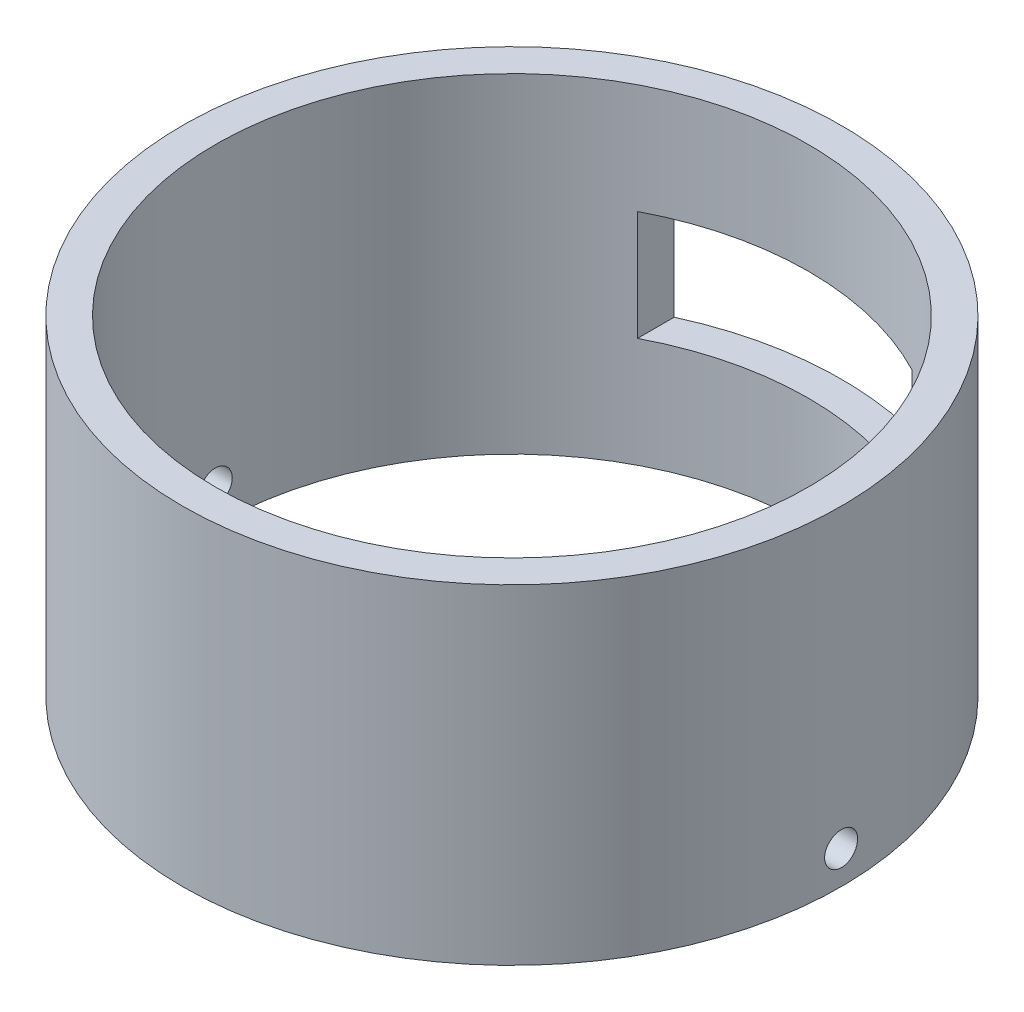
ISO-10303-21;
HEADER;
FILE_DESCRIPTION(('STEP AP214'),'2;1');
FILE_NAME('part.step','',(''),(''),'','','');
FILE_SCHEMA(('AUTOMOTIVE_DESIGN { 1 0 10303 214 1 1 1 1 }'));
ENDSEC;
DATA;
#1=APPLICATION_CONTEXT('core data for automotive mechanical design processes');
#2=APPLICATION_PROTOCOL_DEFINITION('international standard','automotive_design',2000,#1);
#3=PRODUCT_CONTEXT('',#1,'mechanical');
#4=PRODUCT('Part','Part','',(#3));
#5=PRODUCT_RELATED_PRODUCT_CATEGORY('part','',(#4));
#6=PRODUCT_DEFINITION_FORMATION('','',#4);
#7=PRODUCT_DEFINITION_CONTEXT('part definition',#1,'design');
#8=PRODUCT_DEFINITION('design','',#6,#7);
#9=PRODUCT_DEFINITION_SHAPE('','',#8);
#10=(LENGTH_UNIT() NAMED_UNIT(*) SI_UNIT(.MILLI.,.METRE.));
#11=(NAMED_UNIT(*) PLANE_ANGLE_UNIT() SI_UNIT($,.RADIAN.));
#12=(NAMED_UNIT(*) SI_UNIT($,.STERADIAN.) SOLID_ANGLE_UNIT());
#13=UNCERTAINTY_MEASURE_WITH_UNIT(LENGTH_MEASURE(1.E-05),#10,'distance_accuracy_value','');
#14=(GEOMETRIC_REPRESENTATION_CONTEXT(3) GLOBAL_UNCERTAINTY_ASSIGNED_CONTEXT((#13)) GLOBAL_UNIT_ASSIGNED_CONTEXT((#10,
#11,#12)) REPRESENTATION_CONTEXT('',''));
#15=CARTESIAN_POINT('',(0.,0.,0.));
#16=DIRECTION('',(0.,0.,1.));
#17=DIRECTION('',(1.,0.,0.));
#18=AXIS2_PLACEMENT_3D('',#15,#16,#17);
#19=CARTESIAN_POINT('',(0.,30.,0.));
#20=DIRECTION('',(0.,1.,0.));
#21=DIRECTION('',(0.,0.,1.));
#22=AXIS2_PLACEMENT_3D('',#19,#20,#21);
#23=PLANE('',#22);
#24=CARTESIAN_POINT('',(0.,30.,0.));
#25=DIRECTION('',(0.,1.,0.));
#26=DIRECTION('',(0.,0.,1.));
#27=AXIS2_PLACEMENT_3D('',#24,#25,#26);
#28=CIRCLE('',#27,30.);
#29=CARTESIAN_POINT('',(0.,30.,30.));
#30=VERTEX_POINT('',#29);
#31=EDGE_CURVE('E112',#30,#30,#28,.T.);
#32=ORIENTED_EDGE('',*,*,#31,.T.);
#33=EDGE_LOOP('',(#32));
#34=FACE_BOUND('',#33,.T.);
#35=CARTESIAN_POINT('',(0.,30.,0.));
#36=DIRECTION('',(0.,1.,0.));
#37=DIRECTION('',(0.,0.,1.));
#38=AXIS2_PLACEMENT_3D('',#35,#36,#37);
#39=CIRCLE('',#38,27.);
#40=CARTESIAN_POINT('',(0.,30.,27.));
#41=VERTEX_POINT('',#40);
#42=EDGE_CURVE('E104',#41,#41,#39,.T.);
#43=ORIENTED_EDGE('',*,*,#42,.F.);
#44=EDGE_LOOP('',(#43));
#45=FACE_BOUND('',#44,.T.);
#46=ADVANCED_FACE('F36',(#34,#45),#23,.T.);
#47=CARTESIAN_POINT('',(0.,0.,0.));
#48=DIRECTION('',(0.,1.,0.));
#49=DIRECTION('',(0.,0.,1.));
#50=AXIS2_PLACEMENT_3D('',#47,#48,#49);
#51=PLANE('',#50);
#52=CARTESIAN_POINT('',(0.,0.,0.));
#53=DIRECTION('',(0.,1.,0.));
#54=DIRECTION('',(0.,0.,1.));
#55=AXIS2_PLACEMENT_3D('',#52,#53,#54);
#56=CIRCLE('',#55,30.);
#57=CARTESIAN_POINT('',(0.,0.,30.));
#58=VERTEX_POINT('',#57);
#59=EDGE_CURVE('E110',#58,#58,#56,.T.);
#60=ORIENTED_EDGE('',*,*,#59,.F.);
#61=EDGE_LOOP('',(#60));
#62=FACE_BOUND('',#61,.T.);
#63=CARTESIAN_POINT('',(0.,0.,0.));
#64=DIRECTION('',(0.,1.,0.));
#65=DIRECTION('',(0.,0.,1.));
#66=AXIS2_PLACEMENT_3D('',#63,#64,#65);
#67=CIRCLE('',#66,27.);
#68=CARTESIAN_POINT('',(0.,0.,27.));
#69=VERTEX_POINT('',#68);
#70=EDGE_CURVE('E101',#69,#69,#67,.T.);
#71=ORIENTED_EDGE('',*,*,#70,.T.);
#72=EDGE_LOOP('',(#71));
#73=FACE_BOUND('',#72,.T.);
#74=ADVANCED_FACE('F171',(#62,#73),#51,.F.);
#75=CARTESIAN_POINT('',(0.,30.,0.));
#76=DIRECTION('',(0.,-1.,0.));
#77=DIRECTION('',(0.,0.,-1.));
#78=AXIS2_PLACEMENT_3D('',#75,#76,#77);
#79=CYLINDRICAL_SURFACE('',#78,30.);
#80=CARTESIAN_POINT('',(-30.,1.5,0.));
#81=CARTESIAN_POINT('',(-29.9999994982941,1.50000371596039,-0.0841992126832875));
#82=CARTESIAN_POINT('',(-29.9996417281926,1.50711331826338,-0.168458136850036));
#83=CARTESIAN_POINT('',(-29.9982489069002,1.53537410521071,-0.334651580227574));
#84=CARTESIAN_POINT('',(-29.9972130577371,1.55654183406848,-0.416583242008781));
#85=CARTESIAN_POINT('',(-29.994581319066,1.61231130415969,-0.575690637565501));
#86=CARTESIAN_POINT('',(-29.9929857150113,1.64690619901417,-0.652868771917124));
#87=CARTESIAN_POINT('',(-29.9894141701653,1.72853745969476,-0.800301559187851));
#88=CARTESIAN_POINT('',(-29.987438319187,1.77557088856123,-0.870557841111931));
#89=CARTESIAN_POINT('',(-29.9833263203305,1.88079700805631,-1.00224448930937));
#90=CARTESIAN_POINT('',(-29.9811900323378,1.93899952360682,-1.06366700108493));
#91=CARTESIAN_POINT('',(-29.9769991403279,2.06489204850496,-1.1758756183212));
#92=CARTESIAN_POINT('',(-29.9749445396501,2.13258244522722,-1.22666128928588));
#93=CARTESIAN_POINT('',(-29.9711477201023,2.27557044902219,-1.3161762583419));
#94=CARTESIAN_POINT('',(-29.969405660334,2.35087190025168,-1.35489942324752));
#95=CARTESIAN_POINT('',(-29.9664320766967,2.50691742239938,-1.41915082297219));
#96=CARTESIAN_POINT('',(-29.9652005489535,2.58766145201014,-1.44467915792307));
#97=CARTESIAN_POINT('',(-29.9633881722544,2.75222785516139,-1.4817954922831));
#98=CARTESIAN_POINT('',(-29.9628067748292,2.83604757220162,-1.4933952428733));
#99=CARTESIAN_POINT('',(-29.9623585750058,3.00444633610509,-1.5023613905524));
#100=CARTESIAN_POINT('',(-29.9624917669684,3.0890253769708,-1.49972789996418));
#101=CARTESIAN_POINT('',(-29.9634572162788,3.25646202434882,-1.48031211001844));
#102=CARTESIAN_POINT('',(-29.9642888462857,3.33932110732149,-1.46354250774894));
#103=CARTESIAN_POINT('',(-29.9665564507146,3.50104667105727,-1.41635019807595));
#104=CARTESIAN_POINT('',(-29.9679924276905,3.57991313494759,-1.38592743297957));
#105=CARTESIAN_POINT('',(-29.9713076019097,3.73145563309369,-1.31227788828427));
#106=CARTESIAN_POINT('',(-29.9731869994545,3.80412884948854,-1.26904531998985));
#107=CARTESIAN_POINT('',(-29.9771769840148,3.94119110504142,-1.17100760081353));
#108=CARTESIAN_POINT('',(-29.9792875726618,4.00558008573075,-1.11620236826096));
#109=CARTESIAN_POINT('',(-29.9835048437456,4.12432000491585,-0.996503387931564));
#110=CARTESIAN_POINT('',(-29.9856115193623,4.17865986008719,-0.931598644778625));
#111=CARTESIAN_POINT('',(-29.9895812923529,4.27567361337274,-0.793581693926331));
#112=CARTESIAN_POINT('',(-29.9914443896669,4.31834750861741,-0.720469484208145));
#113=CARTESIAN_POINT('',(-29.9947171137912,4.39081692333469,-0.568106505265407));
#114=CARTESIAN_POINT('',(-29.9961267269834,4.4206120560673,-0.488855551783037));
#115=CARTESIAN_POINT('',(-29.9983334185069,4.46647092644949,-0.326467606273835));
#116=CARTESIAN_POINT('',(-29.9991305014237,4.48253476689514,-0.243330643343607));
#117=CARTESIAN_POINT('',(-30.0000217103255,4.50046139887287,-0.0756268510814767));
#118=CARTESIAN_POINT('',(-30.0001165951587,4.50233952061041,0.00893833568201841));
#119=CARTESIAN_POINT('',(-29.9995947289365,4.49188140890103,0.17718266065075));
#120=CARTESIAN_POINT('',(-29.9989779802346,4.47954522246528,0.260861801785493));
#121=CARTESIAN_POINT('',(-29.9971028015194,4.44102136207886,0.424915732818913));
#122=CARTESIAN_POINT('',(-29.9958446957863,4.41484068787067,0.505292170445178));
#123=CARTESIAN_POINT('',(-29.992828448663,4.34937812219082,0.660509858247266));
#124=CARTESIAN_POINT('',(-29.9910703043943,4.31009615530455,0.735351076557828));
#125=CARTESIAN_POINT('',(-29.9872498726375,4.21950682674573,0.877444247844831));
#126=CARTESIAN_POINT('',(-29.9851873258042,4.16818918872196,0.94468964221621));
#127=CARTESIAN_POINT('',(-29.9809912358893,4.05500025172932,1.06961637025234));
#128=CARTESIAN_POINT('',(-29.9788576923523,3.99312888505388,1.12729764255457));
#129=CARTESIAN_POINT('',(-29.9747579179097,3.86052284370967,1.2315103771602));
#130=CARTESIAN_POINT('',(-29.9727918368387,3.78978036877209,1.27803192066247));
#131=CARTESIAN_POINT('',(-29.9692510482457,3.64147964571663,1.35853682885391));
#132=CARTESIAN_POINT('',(-29.9676763390205,3.56392142726329,1.39252024811012));
#133=CARTESIAN_POINT('',(-29.9650969361268,3.40422755746369,1.44696694942588));
#134=CARTESIAN_POINT('',(-29.9640919758971,3.32209406647863,1.46743655476016));
#135=CARTESIAN_POINT('',(-29.9627646470903,3.15555088598699,1.49429525271083));
#136=CARTESIAN_POINT('',(-29.9624422746379,3.07114120940606,1.50068442526798));
#137=CARTESIAN_POINT('',(-29.9625165709538,2.90254047635491,1.49920013162778));
#138=CARTESIAN_POINT('',(-29.9629124530521,2.81834928171879,1.49134226953531));
#139=CARTESIAN_POINT('',(-29.9643769772704,2.65248301702294,1.46161921750531));
#140=CARTESIAN_POINT('',(-29.9654456206724,2.57080795175888,1.43975400087197));
#141=CARTESIAN_POINT('',(-29.968135046136,2.41228913010543,1.38264009901717));
#142=CARTESIAN_POINT('',(-29.9697558322496,2.3354454091771,1.34739131557652));
#143=CARTESIAN_POINT('',(-29.9733668169471,2.18876567490377,1.2645135593488));
#144=CARTESIAN_POINT('',(-29.9753570041959,2.11892944663592,1.21688496641684));
#145=CARTESIAN_POINT('',(-29.9794849660002,1.98816915822806,1.11054372547874));
#146=CARTESIAN_POINT('',(-29.9816228840632,1.92725394842988,1.05182020091046));
#147=CARTESIAN_POINT('',(-29.9858043365659,1.81612746052808,0.924963179847304));
#148=CARTESIAN_POINT('',(-29.9878478476567,1.76591881939845,0.856827371947793));
#149=CARTESIAN_POINT('',(-29.9916116284693,1.67760722953298,0.713026426964385));
#150=CARTESIAN_POINT('',(-29.9933315865963,1.63951592614636,0.637354138093166));
#151=CARTESIAN_POINT('',(-29.9962497906235,1.5766245621877,0.480736308807682));
#152=CARTESIAN_POINT('',(-29.9974486524302,1.5518088026175,0.399797124433937));
#153=CARTESIAN_POINT('',(-29.9988724803088,1.52268217725081,0.265295889027319));
#154=CARTESIAN_POINT('',(-29.9992934419966,1.51418722013798,0.212605024212696));
#155=CARTESIAN_POINT('',(-29.9998573605808,1.50284495732229,0.106617421258442));
#156=CARTESIAN_POINT('',(-30.0000003177144,1.49999764680046,0.0533206836358216));
#157=CARTESIAN_POINT('',(-30.,1.5,0.));
#158=B_SPLINE_CURVE_WITH_KNOTS('',3,(#80,#81,#82,#83,#84,#85,#86,#87,#88,#89,#90,#91,#92,#93,
#94,#95,#96,#97,#98,#99,#100,#101,#102,#103,#104,#105,#106,#107,#108,#109,#110,#111,#112,#113,
#114,#115,#116,#117,#118,#119,#120,#121,#122,#123,#124,#125,#126,#127,#128,#129,#130,#131,#132,
#133,#134,#135,#136,#137,#138,#139,#140,#141,#142,#143,#144,#145,#146,#147,#148,#149,#150,#151,
#152,#153,#154,#155,#156,#157),.UNSPECIFIED.,.T.,.F.,(4,2,2,2,2,2,2,2,2,2,2,2,2,2,2,2,2,2,2,2,2,
2,2,2,2,2,2,2,2,2,2,2,2,2,2,2,2,2,4),(0.,0.25240299765637,0.505103561718774,0.7576754451813,
1.01018774508169,1.26292319493205,1.51566896656381,1.76854303790938,2.02141519023714,
2.27407385073242,2.52673051735231,2.7791604886842,3.03159152669596,3.28413681164744,
3.53668387892216,3.78950784409648,4.04233187145931,4.29516349041915,4.5479932165984,
4.80054967590646,5.05310529993359,5.30553335431042,5.55796286175701,5.8106086894383,
6.06325613800909,6.31612731523398,6.56899739192782,6.82174906367759,7.07449930044228,
7.3269728790031,7.57944693874013,7.83192285136708,8.08439101807935,8.33710798029887,
8.58988711372659,8.84290845133273,9.09562991333956,9.25546884106144,9.41530763239779),.UNSPECIFIED.);
#159=CARTESIAN_POINT('',(-30.,1.5,0.));
#160=VERTEX_POINT('',#159);
#161=EDGE_CURVE('E96',#160,#160,#158,.T.);
#162=ORIENTED_EDGE('',*,*,#161,.T.);
#163=EDGE_LOOP('',(#162));
#164=FACE_BOUND('',#163,.T.);
#165=CARTESIAN_POINT('',(29.9624765331573,3.,-1.5));
#166=CARTESIAN_POINT('',(29.9624770372162,2.91580086150497,-1.49999628397222));
#167=CARTESIAN_POINT('',(29.962835266608,2.83154201127373,-1.49288669377387));
#168=CARTESIAN_POINT('',(29.9642297287393,2.66534872152329,-1.46462595928152));
#169=CARTESIAN_POINT('',(29.9652667603156,2.58341713949153,-1.44345827052283));
#170=CARTESIAN_POINT('',(29.9679010652108,2.42430991251044,-1.38768891775242));
#171=CARTESIAN_POINT('',(29.9694980528928,2.34713186630945,-1.35309410203283));
#172=CARTESIAN_POINT('',(29.9730719610605,2.19969922652003,-1.271463027665));
#173=CARTESIAN_POINT('',(29.975048791834,2.12944300403836,-1.22442970578001));
#174=CARTESIAN_POINT('',(29.9791619233031,1.99775628782395,-1.11920369397771));
#175=CARTESIAN_POINT('',(29.9812983637162,1.93633366763087,-1.06100115527481));
#176=CARTESIAN_POINT('',(29.985488661235,1.82412484140337,-0.935108538671311));
#177=CARTESIAN_POINT('',(29.9875425149671,1.77333906953291,-0.867418073690438));
#178=CARTESIAN_POINT('',(29.9913372650751,1.68382399565718,-0.724430010979664));
#179=CARTESIAN_POINT('',(29.9930780025459,1.64510080811049,-0.649128580822738));
#180=CARTESIAN_POINT('',(29.9960489494894,1.58084936070071,-0.493083104497865));
#181=CARTESIAN_POINT('',(29.9972791628257,1.55532100098023,-0.412339099524105));
#182=CARTESIAN_POINT('',(29.9990894967281,1.51820461382667,-0.247772768188907));
#183=CARTESIAN_POINT('',(29.9996701653544,1.50660483340009,-0.163953098728567));
#184=CARTESIAN_POINT('',(30.0001178121798,1.49763860956657,0.00444557228202867));
#185=CARTESIAN_POINT('',(29.9999847959953,1.50027205415178,0.0890245678515658));
#186=CARTESIAN_POINT('',(29.9990205243754,1.51968777202017,0.256461420139638));
#187=CARTESIAN_POINT('',(29.9981898932546,1.53645739450254,0.339320747918153));
#188=CARTESIAN_POINT('',(29.9959246714313,1.58364982975444,0.501046790855103));
#189=CARTESIAN_POINT('',(29.9944900781967,1.61407269976638,0.579913489272553));
#190=CARTESIAN_POINT('',(29.991177454681,1.68772246012796,0.731456268769944));
#191=CARTESIAN_POINT('',(29.9892992248562,1.73095511443547,0.804129544029278));
#192=CARTESIAN_POINT('',(29.9853108458067,1.82899301635359,0.941191880683595));
#193=CARTESIAN_POINT('',(29.9832006949442,1.88379834568847,1.00558088357129));
#194=CARTESIAN_POINT('',(29.978983382249,2.00349739374138,1.12432069061591));
#195=CARTESIAN_POINT('',(29.9768762262153,2.06840208831534,1.178660431069));
#196=CARTESIAN_POINT('',(29.9729047794271,2.2064189014372,1.27567397617904));
#197=CARTESIAN_POINT('',(29.9710404887371,2.27953102216589,1.31834777773623));
#198=CARTESIAN_POINT('',(29.9677651844501,2.43189397898567,1.39081712539269));
#199=CARTESIAN_POINT('',(29.966354185496,2.51114501328194,1.42061225547781));
#200=CARTESIAN_POINT('',(29.9641451427563,2.67353313415029,1.46647109571372));
#201=CARTESIAN_POINT('',(29.9633470943607,2.75667019149029,1.48253490913895));
#202=CARTESIAN_POINT('',(29.9624548008175,2.92437402449913,1.50046143951967));
#203=CARTESIAN_POINT('',(29.9623597946373,3.00893915484596,1.50233951237468));
#204=CARTESIAN_POINT('',(29.9628823125091,3.17718335516849,1.49188132304581));
#205=CARTESIAN_POINT('',(29.9634998342048,3.26086242807344,1.47954510786832));
#206=CARTESIAN_POINT('',(29.9653771125877,3.42491603574536,1.44102125848948));
#207=CARTESIAN_POINT('',(29.9666365433754,3.50529222504216,1.41484065287852));
#208=CARTESIAN_POINT('',(29.9696554135577,3.66050944662125,1.34937830775901));
#209=CARTESIAN_POINT('',(29.9714148558457,3.73535044686884,1.31009649243498));
#210=CARTESIAN_POINT('',(29.9752372960101,3.87744347447921,1.21950738416592));
#211=CARTESIAN_POINT('',(29.9773005536947,3.94468891864549,1.16818977630626));
#212=CARTESIAN_POINT('',(29.981497160644,4.06961576124229,1.05500087152025));
#213=CARTESIAN_POINT('',(29.9836305103568,4.12729709852266,0.993129507121334));
#214=CARTESIAN_POINT('',(29.9877290769785,4.23150996656878,0.860523436418344));
#215=CARTESIAN_POINT('',(29.9896941433233,4.27803157830691,0.789780929636859));
#216=CARTESIAN_POINT('',(29.9932325258126,4.35853660637076,0.641480125358402));
#217=CARTESIAN_POINT('',(29.994805843662,4.39252007726689,0.563921857527849));
#218=CARTESIAN_POINT('',(29.9973826962819,4.44696681430624,0.404228024563721));
#219=CARTESIAN_POINT('',(29.9983864984446,4.46743642605679,0.32209462741606));
#220=CARTESIAN_POINT('',(29.9997122550948,4.49429516866115,0.155551644264922));
#221=CARTESIAN_POINT('',(30.0000342134294,4.50068437895899,0.0711420711067394));
#222=CARTESIAN_POINT('',(29.9999600152463,4.49920019243027,-0.0974587323412746));
#223=CARTESIAN_POINT('',(29.999564642125,4.4913423547829,-0.181650100387104));
#224=CARTESIAN_POINT('',(29.9981018331539,4.46161929049812,-0.347516717827453));
#225=CARTESIAN_POINT('',(29.9970343960382,4.43975403747596,-0.429191962482231));
#226=CARTESIAN_POINT('',(29.9943475524905,4.38263999847476,-0.587711133113285));
#227=CARTESIAN_POINT('',(29.9927281420037,4.34739111417801,-0.664555023593041));
#228=CARTESIAN_POINT('',(29.9891194758232,4.26451310399524,-0.81123505466916));
#229=CARTESIAN_POINT('',(29.9871302314832,4.21688435814766,-0.88107141029245));
#230=CARTESIAN_POINT('',(29.9830033176299,4.11054295234161,-1.01183168334708));
#231=CARTESIAN_POINT('',(29.9808655042371,4.05181945055255,-1.07274677865547));
#232=CARTESIAN_POINT('',(29.9766833697048,3.92496252168575,-1.18387304623982));
#233=CARTESIAN_POINT('',(29.9746390716975,3.85682678295532,-1.23408158124698));
#234=CARTESIAN_POINT('',(29.9708731658307,3.71302589093275,-1.32239306067115));
#235=CARTESIAN_POINT('',(29.9691518695786,3.63735357354026,-1.3604843396651));
#236=CARTESIAN_POINT('',(29.9662310322912,3.48073568310982,-1.42337565004508));
#237=CARTESIAN_POINT('',(29.9650308752857,3.39979646627244,-1.44819138081059));
#238=CARTESIAN_POINT('',(29.9636054274165,3.2652953083114,-1.4773179225833));
#239=CARTESIAN_POINT('',(29.9631839590812,3.21260455931175,-1.48581284214325));
#240=CARTESIAN_POINT('',(29.9626193524688,3.10661718854603,-1.49715505505153));
#241=CARTESIAN_POINT('',(29.9624762139532,3.05332056729914,-1.50000235323915));
#242=CARTESIAN_POINT('',(29.9624765331573,3.,-1.5));
#243=B_SPLINE_CURVE_WITH_KNOTS('',3,(#165,#166,#167,#168,#169,#170,#171,#172,#173,#174,#175,
#176,#177,#178,#179,#180,#181,#182,#183,#184,#185,#186,#187,#188,#189,#190,#191,#192,#193,#194,
#195,#196,#197,#198,#199,#200,#201,#202,#203,#204,#205,#206,#207,#208,#209,#210,#211,#212,#213,
#214,#215,#216,#217,#218,#219,#220,#221,#222,#223,#224,#225,#226,#227,#228,#229,#230,#231,#232,
#233,#234,#235,#236,#237,#238,#239,#240,#241,#242),.UNSPECIFIED.,.T.,.F.,(4,2,2,2,2,2,2,2,2,2,2,
2,2,2,2,2,2,2,2,2,2,2,2,2,2,2,2,2,2,2,2,2,2,2,2,2,2,2,4),(0.,0.252402774850885,
0.505103120966063,0.757674750307551,1.01018679999478,1.2629225413087,1.5156685965212,
1.76854255964547,2.02141460901224,2.27407313360386,2.52672966991109,2.77916033764387,
3.03159206372378,3.28413754825082,3.53668481627066,3.78950849136503,4.04233223363706,
4.29516414215493,4.54799414908479,4.80055043119032,5.05310587809922,5.30553322930184,
5.55796204130353,5.81060798549992,6.06325554497973,6.3161268383656,6.5689970311533,
6.82174840085849,7.0744983444935,7.32697242654597,7.57944698416684,7.83192339653088,
8.08439205925959,8.33710872331969,8.589887565506,8.84290902947146,9.0956306104889,
9.25546918978481,9.415307632119),.UNSPECIFIED.);
#244=CARTESIAN_POINT('',(29.9624765331573,3.,-1.5));
#245=VERTEX_POINT('',#244);
#246=EDGE_CURVE('E143',#245,#245,#243,.T.);
#247=ORIENTED_EDGE('',*,*,#246,.T.);
#248=EDGE_LOOP('',(#247));
#249=FACE_BOUND('',#248,.T.);
#250=CARTESIAN_POINT('',(0.,10.,0.));
#251=DIRECTION('',(0.,-1.,0.));
#252=DIRECTION('',(0.,0.,-1.));
#253=AXIS2_PLACEMENT_3D('',#250,#251,#252);
#254=CIRCLE('',#253,30.);
#255=CARTESIAN_POINT('',(-12.5,10.,-27.2717802865893));
#256=VERTEX_POINT('',#255);
#257=CARTESIAN_POINT('',(12.5,10.,-27.2717802865893));
#258=VERTEX_POINT('',#257);
#259=EDGE_CURVE('E100',#256,#258,#254,.T.);
#260=ORIENTED_EDGE('',*,*,#259,.T.);
#261=DIRECTION('',(0.,-1.,0.));
#262=VECTOR('',#261,1.);
#263=CARTESIAN_POINT('',(12.5,30.,-27.2717802865893));
#264=LINE('',#263,#262);
#265=CARTESIAN_POINT('',(12.5,20.,-27.2717802865893));
#266=VERTEX_POINT('',#265);
#267=EDGE_CURVE('E92',#258,#266,#264,.F.);
#268=ORIENTED_EDGE('',*,*,#267,.T.);
#269=CARTESIAN_POINT('',(0.,20.,0.));
#270=DIRECTION('',(0.,1.,0.));
#271=DIRECTION('',(0.,0.,1.));
#272=AXIS2_PLACEMENT_3D('',#269,#270,#271);
#273=CIRCLE('',#272,30.);
#274=CARTESIAN_POINT('',(-12.5,20.,-27.2717802865893));
#275=VERTEX_POINT('',#274);
#276=EDGE_CURVE('E81',#266,#275,#273,.T.);
#277=ORIENTED_EDGE('',*,*,#276,.T.);
#278=DIRECTION('',(0.,-1.,0.));
#279=VECTOR('',#278,1.);
#280=CARTESIAN_POINT('',(-12.5,30.,-27.2717802865893));
#281=LINE('',#280,#279);
#282=EDGE_CURVE('E86',#275,#256,#281,.T.);
#283=ORIENTED_EDGE('',*,*,#282,.T.);
#284=EDGE_LOOP('',(#260,#268,#277,#283));
#285=FACE_BOUND('',#284,.T.);
#286=ORIENTED_EDGE('',*,*,#31,.F.);
#287=EDGE_LOOP('',(#286));
#288=FACE_BOUND('',#287,.T.);
#289=ORIENTED_EDGE('',*,*,#59,.T.);
#290=EDGE_LOOP('',(#289));
#291=FACE_BOUND('',#290,.T.);
#292=ADVANCED_FACE('F38',(#164,#249,#285,#288,#291),#79,.T.);
#293=CARTESIAN_POINT('',(0.,30.,0.));
#294=DIRECTION('',(0.,-1.,0.));
#295=DIRECTION('',(0.,0.,-1.));
#296=AXIS2_PLACEMENT_3D('',#293,#294,#295);
#297=CYLINDRICAL_SURFACE('',#296,27.);
#298=CARTESIAN_POINT('',(-26.9583011334171,3.,-1.5));
#299=CARTESIAN_POINT('',(-26.9583016926156,3.08418587514809,-1.49999628908537));
#300=CARTESIAN_POINT('',(-26.958699718669,3.16843113781006,-1.49288892933033));
#301=CARTESIAN_POINT('',(-26.9602490567303,3.33459671615186,-1.46463757192525));
#302=CARTESIAN_POINT('',(-26.9614012517855,3.41651418878497,-1.4434771192537));
#303=CARTESIAN_POINT('',(-26.9643280146725,3.57559312392583,-1.38772811617942));
#304=CARTESIAN_POINT('',(-26.9661022604971,3.65275702288877,-1.35314651230108));
#305=CARTESIAN_POINT('',(-26.9700727984468,3.8001641670454,-1.27154775858948));
#306=CARTESIAN_POINT('',(-26.9722689921612,3.8704090201967,-1.22453350745466));
#307=CARTESIAN_POINT('',(-26.9768390004472,4.00209017069114,-1.11934080388828));
#308=CARTESIAN_POINT('',(-26.9792130024223,4.06351696952866,-1.06115046832199));
#309=CARTESIAN_POINT('',(-26.9838693710248,4.17573720037153,-0.935281539688322));
#310=CARTESIAN_POINT('',(-26.9861517338749,4.22653019440324,-0.867602556004396));
#311=CARTESIAN_POINT('',(-26.9903691638363,4.31606852177138,-0.724625998930942));
#312=CARTESIAN_POINT('',(-26.992304011401,4.35480625030208,-0.649323656038152));
#313=CARTESIAN_POINT('',(-26.9956064538319,4.41908567270194,-0.493271460131775));
#314=CARTESIAN_POINT('',(-26.9969740537322,4.44462748368152,-0.412521655470217));
#315=CARTESIAN_POINT('',(-26.9989866222267,4.48176437533457,-0.247955971128942));
#316=CARTESIAN_POINT('',(-26.9996323426543,4.49337396726727,-0.164143375487503));
#317=CARTESIAN_POINT('',(-27.0001309157998,4.50236166343217,0.00424330994695761));
#318=CARTESIAN_POINT('',(-26.9999837758825,4.49973989986148,0.0888173926591307));
#319=CARTESIAN_POINT('',(-26.9989138393268,4.48035131729116,0.256228033151784));
#320=CARTESIAN_POINT('',(-26.9979918989413,4.46360011304263,0.339066405577007));
#321=CARTESIAN_POINT('',(-26.9954771719553,4.41645237067659,0.50075362932553));
#322=CARTESIAN_POINT('',(-26.9938843820587,4.38605576551514,0.579602461044903));
#323=CARTESIAN_POINT('',(-26.9902058653875,4.31246231621176,0.731122592059612));
#324=CARTESIAN_POINT('',(-26.9881198653778,4.26925837351001,0.803790436677067));
#325=CARTESIAN_POINT('',(-26.9836897806358,4.17128182528288,0.940848075473341));
#326=CARTESIAN_POINT('',(-26.9813456936297,4.11650911783187,1.0052377967104));
#327=CARTESIAN_POINT('',(-26.9766596049253,3.99686159791164,1.12400249751846));
#328=CARTESIAN_POINT('',(-26.9743176103241,3.93197323591464,1.17836382805753));
#329=CARTESIAN_POINT('',(-26.9699029144309,3.79398389459839,1.27542344545077));
#330=CARTESIAN_POINT('',(-26.967830213224,3.72088291268485,1.31812172862068));
#331=CARTESIAN_POINT('',(-26.964188092217,3.56853497840458,1.39064210422698));
#332=CARTESIAN_POINT('',(-26.9626186934834,3.48928776895003,1.42046365770535));
#333=CARTESIAN_POINT('',(-26.9601609427562,3.32690074358222,1.46637480539112));
#334=CARTESIAN_POINT('',(-26.9592725844377,3.24376096382719,1.48246452712738));
#335=CARTESIAN_POINT('',(-26.958278272569,3.07606779514948,1.50043835052844));
#336=CARTESIAN_POINT('',(-26.9581712749681,2.9915164439249,1.50234140842035));
#337=CARTESIAN_POINT('',(-26.9587490243982,2.82329566039911,1.4919373767457));
#338=CARTESIAN_POINT('',(-26.9594337681857,2.73962622448624,1.47963034539568));
#339=CARTESIAN_POINT('',(-26.9615168746517,2.5755977355971,1.44117121887049));
#340=CARTESIAN_POINT('',(-26.9629147889374,2.49523663683167,1.41502782267206));
#341=CARTESIAN_POINT('',(-26.9662663076979,2.34004290544278,1.34964688791461));
#342=CARTESIAN_POINT('',(-26.9682199161513,2.26521031240574,1.31040925560647));
#343=CARTESIAN_POINT('',(-26.9724651857645,2.1231106605443,1.21990509675262));
#344=CARTESIAN_POINT('',(-26.9747572034471,2.0558517141017,1.16862585000513));
#345=CARTESIAN_POINT('',(-26.979419724351,1.93089024216959,1.05551264598903));
#346=CARTESIAN_POINT('',(-26.981790228185,1.87318779130384,0.993678606308918));
#347=CARTESIAN_POINT('',(-26.9863456171341,1.76891343219578,0.861129569232814));
#348=CARTESIAN_POINT('',(-26.9885302962119,1.72235377768629,0.790404923968643));
#349=CARTESIAN_POINT('',(-26.9924648870714,1.64177047122725,0.642130948125078));
#350=CARTESIAN_POINT('',(-26.9942148010761,1.60774675518269,0.564581652441957));
#351=CARTESIAN_POINT('',(-26.9970816779976,1.55322251489528,0.404905076190289));
#352=CARTESIAN_POINT('',(-26.9981990061314,1.532714186561,0.322780467277286));
#353=CARTESIAN_POINT('',(-26.9996762530702,1.50577732823223,0.156247185421669));
#354=CARTESIAN_POINT('',(-27.0000361774734,1.49934869417027,0.071838529365839));
#355=CARTESIAN_POINT('',(-26.9999580786707,1.50075469689387,-0.0967453229770052));
#356=CARTESIAN_POINT('',(-26.9995211297025,1.50857013172624,-0.180920680582924));
#357=CARTESIAN_POINT('',(-26.9979005758685,1.5382026760377,-0.346762132324284));
#358=CARTESIAN_POINT('',(-26.996716969632,1.56001981122282,-0.428428221852615));
#359=CARTESIAN_POINT('',(-26.9937362106978,1.61703232929465,-0.586936433157346));
#360=CARTESIAN_POINT('',(-26.9919390567577,1.65222773927354,-0.663778545164401));
#361=CARTESIAN_POINT('',(-26.9879331766107,1.73499474867214,-0.810464878598945));
#362=CARTESIAN_POINT('',(-26.9857244622195,1.78256599280258,-0.880309300838556));
#363=CARTESIAN_POINT('',(-26.9811405267115,1.88880421303278,-1.01111431469215));
#364=CARTESIAN_POINT('',(-26.9787651031527,1.94748483173565,-1.07206381840443));
#365=CARTESIAN_POINT('',(-26.9741169768662,2.07426221803655,-1.18326659304224));
#366=CARTESIAN_POINT('',(-26.9718442994983,2.14236129362824,-1.23351723452253));
#367=CARTESIAN_POINT('',(-26.9676562041873,2.28610614690005,-1.32192508126942));
#368=CARTESIAN_POINT('',(-26.9657411733907,2.36175996811549,-1.36006921231204));
#369=CARTESIAN_POINT('',(-26.9624902781899,2.51835276650993,-1.42306796376381));
#370=CARTESIAN_POINT('',(-26.9611537324376,2.59928539617713,-1.44793822642327));
#371=CARTESIAN_POINT('',(-26.9595631636977,2.73393140846995,-1.47718450102821));
#372=CARTESIAN_POINT('',(-26.9590920010331,2.78677338265185,-1.48572933140815));
#373=CARTESIAN_POINT('',(-26.9584608084498,2.89306891699522,-1.49713825648521));
#374=CARTESIAN_POINT('',(-26.9583007781967,2.94652247649908,-1.50000235729003));
#375=CARTESIAN_POINT('',(-26.9583011334171,3.,-1.5));
#376=B_SPLINE_CURVE_WITH_KNOTS('',3,(#298,#299,#300,#301,#302,#303,#304,#305,#306,#307,#308,
#309,#310,#311,#312,#313,#314,#315,#316,#317,#318,#319,#320,#321,#322,#323,#324,#325,#326,#327,
#328,#329,#330,#331,#332,#333,#334,#335,#336,#337,#338,#339,#340,#341,#342,#343,#344,#345,#346,
#347,#348,#349,#350,#351,#352,#353,#354,#355,#356,#357,#358,#359,#360,#361,#362,#363,#364,#365,
#366,#367,#368,#369,#370,#371,#372,#373,#374,#375),.UNSPECIFIED.,.T.,.F.,(4,2,2,2,2,2,2,2,2,2,2,
2,2,2,2,2,2,2,2,2,2,2,2,2,2,2,2,2,2,2,2,2,2,2,2,2,2,2,4),(0.,0.252362406627231,
0.505020831197885,0.757548658753191,1.01001766073357,1.26275660523791,1.51550595723321,
1.76841442904392,2.02132065631767,2.27396323700654,2.52660347086601,2.77896487177466,
3.03132751262408,3.28383028966053,3.53633529144444,3.78918146693381,4.04202772229494,
4.29488455955936,4.54773904849201,4.80025561247085,5.05277114193196,5.30512810215346,
5.55748686918163,5.81011342510531,6.06274195361965,6.31564703411356,6.56855082151088,
6.82130844827455,7.07406420682021,7.32647948576716,7.57889522813027,7.83131148166004,
8.08372048954551,8.33644149687105,8.58922454359053,8.84227965753653,9.09503590303671,
9.25534463674706,9.41565319809914),.UNSPECIFIED.);
#377=CARTESIAN_POINT('',(-26.9583011334171,3.,-1.5));
#378=VERTEX_POINT('',#377);
#379=EDGE_CURVE('E41',#378,#378,#376,.T.);
#380=ORIENTED_EDGE('',*,*,#379,.F.);
#381=EDGE_LOOP('',(#380));
#382=FACE_BOUND('',#381,.T.);
#383=CARTESIAN_POINT('',(26.9583011334171,3.,-1.5));
#384=CARTESIAN_POINT('',(26.9583016926156,2.91581412485191,-1.49999628908537));
#385=CARTESIAN_POINT('',(26.958699718669,2.83156886218994,-1.49288892933033));
#386=CARTESIAN_POINT('',(26.9602490567303,2.66540328384814,-1.46463757192525));
#387=CARTESIAN_POINT('',(26.9614012517855,2.58348581121503,-1.4434771192537));
#388=CARTESIAN_POINT('',(26.9643280146725,2.42440687607417,-1.38772811617942));
#389=CARTESIAN_POINT('',(26.9661022604971,2.34724297711123,-1.35314651230108));
#390=CARTESIAN_POINT('',(26.9700727984468,2.1998358329546,-1.27154775858948));
#391=CARTESIAN_POINT('',(26.9722689921612,2.1295909798033,-1.22453350745466));
#392=CARTESIAN_POINT('',(26.9768390004472,1.99790982930886,-1.11934080388828));
#393=CARTESIAN_POINT('',(26.9792130024223,1.93648303047134,-1.06115046832199));
#394=CARTESIAN_POINT('',(26.9838693710248,1.82426279962848,-0.935281539688322));
#395=CARTESIAN_POINT('',(26.9861517338749,1.77346980559676,-0.867602556004395));
#396=CARTESIAN_POINT('',(26.9903691638363,1.68393147822862,-0.724625998930942));
#397=CARTESIAN_POINT('',(26.992304011401,1.64519374969792,-0.649323656038153));
#398=CARTESIAN_POINT('',(26.9956064538319,1.58091432729806,-0.493271460131775));
#399=CARTESIAN_POINT('',(26.9969740537322,1.55537251631848,-0.412521655470217));
#400=CARTESIAN_POINT('',(26.9989866222267,1.51823562466543,-0.247955971128942));
#401=CARTESIAN_POINT('',(26.9996323426543,1.50662603273273,-0.164143375487504));
#402=CARTESIAN_POINT('',(27.0001309157998,1.49763833656783,0.00424330994695733));
#403=CARTESIAN_POINT('',(26.9999837758825,1.50026010013852,0.0888173926591305));
#404=CARTESIAN_POINT('',(26.9989138393268,1.51964868270884,0.256228033151784));
#405=CARTESIAN_POINT('',(26.9979918989413,1.53639988695738,0.339066405577007));
#406=CARTESIAN_POINT('',(26.9954771719553,1.58354762932341,0.50075362932553));
#407=CARTESIAN_POINT('',(26.9938843820587,1.61394423448486,0.579602461044903));
#408=CARTESIAN_POINT('',(26.9902058653875,1.68753768378824,0.731122592059611));
#409=CARTESIAN_POINT('',(26.9881198653778,1.73074162648999,0.803790436677066));
#410=CARTESIAN_POINT('',(26.9836897806358,1.82871817471712,0.94084807547334));
#411=CARTESIAN_POINT('',(26.9813456936297,1.88349088216812,1.0052377967104));
#412=CARTESIAN_POINT('',(26.9766596049253,2.00313840208835,1.12400249751846));
#413=CARTESIAN_POINT('',(26.9743176103241,2.06802676408536,1.17836382805753));
#414=CARTESIAN_POINT('',(26.9699029144309,2.20601610540161,1.27542344545077));
#415=CARTESIAN_POINT('',(26.967830213224,2.27911708731515,1.31812172862068));
#416=CARTESIAN_POINT('',(26.964188092217,2.43146502159542,1.39064210422698));
#417=CARTESIAN_POINT('',(26.9626186934834,2.51071223104997,1.42046365770535));
#418=CARTESIAN_POINT('',(26.9601609427562,2.67309925641778,1.46637480539112));
#419=CARTESIAN_POINT('',(26.9592725844377,2.75623903617281,1.48246452712738));
#420=CARTESIAN_POINT('',(26.958278272569,2.92393220485052,1.50043835052844));
#421=CARTESIAN_POINT('',(26.9581712749681,3.0084835560751,1.50234140842035));
#422=CARTESIAN_POINT('',(26.9587490243982,3.17670433960089,1.4919373767457));
#423=CARTESIAN_POINT('',(26.9594337681857,3.26037377551376,1.47963034539568));
#424=CARTESIAN_POINT('',(26.9615168746517,3.4244022644029,1.44117121887049));
#425=CARTESIAN_POINT('',(26.9629147889374,3.50476336316833,1.41502782267206));
#426=CARTESIAN_POINT('',(26.9662663076979,3.65995709455722,1.34964688791461));
#427=CARTESIAN_POINT('',(26.9682199161513,3.73478968759426,1.31040925560647));
#428=CARTESIAN_POINT('',(26.9724651857645,3.8768893394557,1.21990509675262));
#429=CARTESIAN_POINT('',(26.9747572034471,3.9441482858983,1.16862585000513));
#430=CARTESIAN_POINT('',(26.979419724351,4.06910975783041,1.05551264598903));
#431=CARTESIAN_POINT('',(26.981790228185,4.12681220869616,0.993678606308919));
#432=CARTESIAN_POINT('',(26.9863456171341,4.23108656780422,0.861129569232815));
#433=CARTESIAN_POINT('',(26.9885302962119,4.27764622231371,0.790404923968644));
#434=CARTESIAN_POINT('',(26.9924648870714,4.35822952877276,0.642130948125078));
#435=CARTESIAN_POINT('',(26.9942148010761,4.39225324481731,0.564581652441957));
#436=CARTESIAN_POINT('',(26.9970816779976,4.44677748510472,0.404905076190289));
#437=CARTESIAN_POINT('',(26.9981990061314,4.467285813439,0.322780467277287));
#438=CARTESIAN_POINT('',(26.9996762530702,4.49422267176777,0.15624718542167));
#439=CARTESIAN_POINT('',(27.0000361774734,4.50065130582973,0.0718385293658396));
#440=CARTESIAN_POINT('',(26.9999580786707,4.49924530310613,-0.0967453229770045));
#441=CARTESIAN_POINT('',(26.9995211297025,4.49142986827376,-0.180920680582923));
#442=CARTESIAN_POINT('',(26.9979005758686,4.4617973239623,-0.346762132324283));
#443=CARTESIAN_POINT('',(26.996716969632,4.43998018877718,-0.428428221852615));
#444=CARTESIAN_POINT('',(26.9937362106978,4.38296767070535,-0.586936433157345));
#445=CARTESIAN_POINT('',(26.9919390567577,4.34777226072646,-0.663778545164401));
#446=CARTESIAN_POINT('',(26.9879331766107,4.26500525132786,-0.810464878598944));
#447=CARTESIAN_POINT('',(26.9857244622195,4.21743400719742,-0.880309300838556));
#448=CARTESIAN_POINT('',(26.9811405267115,4.11119578696722,-1.01111431469215));
#449=CARTESIAN_POINT('',(26.9787651031527,4.05251516826435,-1.07206381840443));
#450=CARTESIAN_POINT('',(26.9741169768662,3.92573778196344,-1.18326659304224));
#451=CARTESIAN_POINT('',(26.9718442994983,3.85763870637176,-1.23351723452253));
#452=CARTESIAN_POINT('',(26.9676562041873,3.71389385309995,-1.32192508126942));
#453=CARTESIAN_POINT('',(26.9657411733907,3.63824003188451,-1.36006921231204));
#454=CARTESIAN_POINT('',(26.9624902781899,3.48164723349007,-1.42306796376381));
#455=CARTESIAN_POINT('',(26.9611537324376,3.40071460382287,-1.44793822642327));
#456=CARTESIAN_POINT('',(26.9595631636977,3.26606859153005,-1.47718450102821));
#457=CARTESIAN_POINT('',(26.9590920010331,3.21322661734815,-1.48572933140815));
#458=CARTESIAN_POINT('',(26.9584608084498,3.10693108300478,-1.49713825648521));
#459=CARTESIAN_POINT('',(26.9583007781967,3.05347752350092,-1.50000235729003));
#460=CARTESIAN_POINT('',(26.9583011334171,3.,-1.5));
#461=B_SPLINE_CURVE_WITH_KNOTS('',3,(#383,#384,#385,#386,#387,#388,#389,#390,#391,#392,#393,
#394,#395,#396,#397,#398,#399,#400,#401,#402,#403,#404,#405,#406,#407,#408,#409,#410,#411,#412,
#413,#414,#415,#416,#417,#418,#419,#420,#421,#422,#423,#424,#425,#426,#427,#428,#429,#430,#431,
#432,#433,#434,#435,#436,#437,#438,#439,#440,#441,#442,#443,#444,#445,#446,#447,#448,#449,#450,
#451,#452,#453,#454,#455,#456,#457,#458,#459,#460),.UNSPECIFIED.,.T.,.F.,(4,2,2,2,2,2,2,2,2,2,2,
2,2,2,2,2,2,2,2,2,2,2,2,2,2,2,2,2,2,2,2,2,2,2,2,2,2,2,4),(0.,0.252362406627231,
0.505020831197885,0.757548658753191,1.01001766073357,1.26275660523791,1.51550595723321,
1.76841442904392,2.02132065631767,2.27396323700654,2.526603470866,2.77896487177466,
3.03132751262408,3.28383028966053,3.53633529144444,3.78918146693381,4.04202772229494,
4.29488455955936,4.547739048492,4.80025561247084,5.05277114193196,5.30512810215346,
5.55748686918163,5.8101134251053,6.06274195361964,6.31564703411356,6.56855082151088,
6.82130844827455,7.07406420682021,7.32647948576716,7.57889522813027,7.83131148166004,
8.08372048954551,8.33644149687105,8.58922454359053,8.84227965753653,9.0950359030367,
9.25534463674705,9.41565319809914),.UNSPECIFIED.);
#462=CARTESIAN_POINT('',(26.9583011334171,3.,-1.5));
#463=VERTEX_POINT('',#462);
#464=EDGE_CURVE('E121',#463,#463,#461,.T.);
#465=ORIENTED_EDGE('',*,*,#464,.F.);
#466=EDGE_LOOP('',(#465));
#467=FACE_BOUND('',#466,.T.);
#468=DIRECTION('',(0.,-1.,0.));
#469=VECTOR('',#468,1.);
#470=CARTESIAN_POINT('',(12.5,30.,-23.9321958875486));
#471=LINE('',#470,#469);
#472=CARTESIAN_POINT('',(12.5,10.,-23.9321958875486));
#473=VERTEX_POINT('',#472);
#474=CARTESIAN_POINT('',(12.5,20.,-23.9321958875486));
#475=VERTEX_POINT('',#474);
#476=EDGE_CURVE('E11',#473,#475,#471,.F.);
#477=ORIENTED_EDGE('',*,*,#476,.F.);
#478=CARTESIAN_POINT('',(0.,10.,0.));
#479=DIRECTION('',(0.,-1.,0.));
#480=DIRECTION('',(0.,0.,-1.));
#481=AXIS2_PLACEMENT_3D('',#478,#479,#480);
#482=CIRCLE('',#481,27.);
#483=CARTESIAN_POINT('',(-12.5,10.,-23.9321958875486));
#484=VERTEX_POINT('',#483);
#485=EDGE_CURVE('E51',#484,#473,#482,.T.);
#486=ORIENTED_EDGE('',*,*,#485,.F.);
#487=DIRECTION('',(0.,-1.,0.));
#488=VECTOR('',#487,1.);
#489=CARTESIAN_POINT('',(-12.5,30.,-23.9321958875486));
#490=LINE('',#489,#488);
#491=CARTESIAN_POINT('',(-12.5,20.,-23.9321958875486));
#492=VERTEX_POINT('',#491);
#493=EDGE_CURVE('E119',#492,#484,#490,.T.);
#494=ORIENTED_EDGE('',*,*,#493,.F.);
#495=CARTESIAN_POINT('',(0.,20.,0.));
#496=DIRECTION('',(0.,1.,0.));
#497=DIRECTION('',(0.,0.,1.));
#498=AXIS2_PLACEMENT_3D('',#495,#496,#497);
#499=CIRCLE('',#498,27.);
#500=EDGE_CURVE('E115',#475,#492,#499,.T.);
#501=ORIENTED_EDGE('',*,*,#500,.F.);
#502=EDGE_LOOP('',(#477,#486,#494,#501));
#503=FACE_BOUND('',#502,.T.);
#504=ORIENTED_EDGE('',*,*,#42,.T.);
#505=EDGE_LOOP('',(#504));
#506=FACE_BOUND('',#505,.T.);
#507=ORIENTED_EDGE('',*,*,#70,.F.);
#508=EDGE_LOOP('',(#507));
#509=FACE_BOUND('',#508,.T.);
#510=ADVANCED_FACE('F126',(#382,#467,#503,#506,#509),#297,.F.);
#511=CARTESIAN_POINT('',(12.5,20.,-50.));
#512=DIRECTION('',(1.,0.,0.));
#513=DIRECTION('',(0.,1.,0.));
#514=AXIS2_PLACEMENT_3D('',#511,#512,#513);
#515=PLANE('',#514);
#516=DIRECTION('',(0.,0.,1.));
#517=VECTOR('',#516,1.);
#518=CARTESIAN_POINT('',(12.5,10.,-50.));
#519=LINE('',#518,#517);
#520=EDGE_CURVE('E87',#258,#473,#519,.T.);
#521=ORIENTED_EDGE('',*,*,#520,.T.);
#522=ORIENTED_EDGE('',*,*,#476,.T.);
#523=DIRECTION('',(0.,0.,1.));
#524=VECTOR('',#523,1.);
#525=CARTESIAN_POINT('',(12.5,20.,-50.));
#526=LINE('',#525,#524);
#527=EDGE_CURVE('E64',#266,#475,#526,.T.);
#528=ORIENTED_EDGE('',*,*,#527,.F.);
#529=ORIENTED_EDGE('',*,*,#267,.F.);
#530=EDGE_LOOP('',(#521,#522,#528,#529));
#531=FACE_BOUND('',#530,.T.);
#532=ADVANCED_FACE('F91',(#531),#515,.F.);
#533=CARTESIAN_POINT('',(-12.5,10.,-50.));
#534=DIRECTION('',(0.,-1.,0.));
#535=DIRECTION('',(0.,0.,-1.));
#536=AXIS2_PLACEMENT_3D('',#533,#534,#535);
#537=PLANE('',#536);
#538=DIRECTION('',(0.,0.,1.));
#539=VECTOR('',#538,1.);
#540=CARTESIAN_POINT('',(-12.5,10.,-50.));
#541=LINE('',#540,#539);
#542=EDGE_CURVE('E154',#256,#484,#541,.T.);
#543=ORIENTED_EDGE('',*,*,#542,.T.);
#544=ORIENTED_EDGE('',*,*,#485,.T.);
#545=ORIENTED_EDGE('',*,*,#520,.F.);
#546=ORIENTED_EDGE('',*,*,#259,.F.);
#547=EDGE_LOOP('',(#543,#544,#545,#546));
#548=FACE_BOUND('',#547,.T.);
#549=ADVANCED_FACE('F136',(#548),#537,.F.);
#550=CARTESIAN_POINT('',(-12.5,20.,-50.));
#551=DIRECTION('',(-1.,0.,0.));
#552=DIRECTION('',(0.,0.,1.));
#553=AXIS2_PLACEMENT_3D('',#550,#551,#552);
#554=PLANE('',#553);
#555=DIRECTION('',(0.,0.,1.));
#556=VECTOR('',#555,1.);
#557=CARTESIAN_POINT('',(-12.5,20.,-50.));
#558=LINE('',#557,#556);
#559=EDGE_CURVE('E59',#275,#492,#558,.T.);
#560=ORIENTED_EDGE('',*,*,#559,.T.);
#561=ORIENTED_EDGE('',*,*,#493,.T.);
#562=ORIENTED_EDGE('',*,*,#542,.F.);
#563=ORIENTED_EDGE('',*,*,#282,.F.);
#564=EDGE_LOOP('',(#560,#561,#562,#563));
#565=FACE_BOUND('',#564,.T.);
#566=ADVANCED_FACE('F159',(#565),#554,.F.);
#567=CARTESIAN_POINT('',(-12.5,20.,-50.));
#568=DIRECTION('',(0.,1.,0.));
#569=DIRECTION('',(0.,0.,1.));
#570=AXIS2_PLACEMENT_3D('',#567,#568,#569);
#571=PLANE('',#570);
#572=ORIENTED_EDGE('',*,*,#527,.T.);
#573=ORIENTED_EDGE('',*,*,#500,.T.);
#574=ORIENTED_EDGE('',*,*,#559,.F.);
#575=ORIENTED_EDGE('',*,*,#276,.F.);
#576=EDGE_LOOP('',(#572,#573,#574,#575));
#577=FACE_BOUND('',#576,.T.);
#578=ADVANCED_FACE('F82',(#577),#571,.F.);
#579=CARTESIAN_POINT('',(-30.,3.,0.));
#580=DIRECTION('',(1.,0.,0.));
#581=DIRECTION('',(0.,0.,-1.));
#582=AXIS2_PLACEMENT_3D('',#579,#580,#581);
#583=CYLINDRICAL_SURFACE('',#582,1.5);
#584=ORIENTED_EDGE('',*,*,#464,.T.);
#585=EDGE_LOOP('',(#584));
#586=FACE_BOUND('',#585,.T.);
#587=ORIENTED_EDGE('',*,*,#246,.F.);
#588=EDGE_LOOP('',(#587));
#589=FACE_BOUND('',#588,.T.);
#590=ADVANCED_FACE('F134',(#586,#589),#583,.F.);
#591=ORIENTED_EDGE('',*,*,#379,.T.);
#592=EDGE_LOOP('',(#591));
#593=FACE_BOUND('',#592,.T.);
#594=ORIENTED_EDGE('',*,*,#161,.F.);
#595=EDGE_LOOP('',(#594));
#596=FACE_BOUND('',#595,.T.);
#597=ADVANCED_FACE('F130',(#593,#596),#583,.F.);
#598=CLOSED_SHELL('',(#46,#74,#292,#510,#532,#549,#566,#578,#590,#597));
#599=MANIFOLD_SOLID_BREP('B2',#598);
#600=ADVANCED_BREP_SHAPE_REPRESENTATION('',(#18,#599),#14);
#601=SHAPE_DEFINITION_REPRESENTATION(#9,#600);
ENDSEC;
END-ISO-10303-21;
